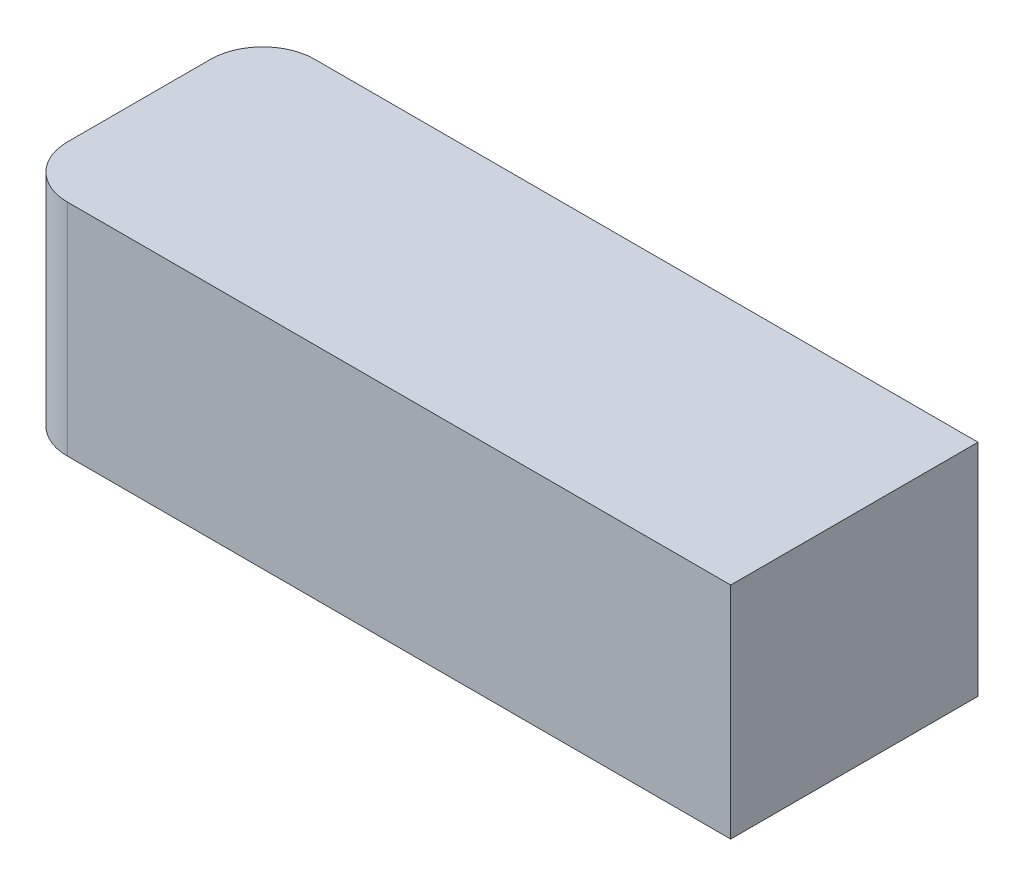
ISO-10303-21;
HEADER;
FILE_DESCRIPTION(('STEP AP214'),'2;1');
FILE_NAME('part.step','',(''),(''),'','','');
FILE_SCHEMA(('AUTOMOTIVE_DESIGN { 1 0 10303 214 1 1 1 1 }'));
ENDSEC;
DATA;
#1=APPLICATION_CONTEXT('core data for automotive mechanical design processes');
#2=APPLICATION_PROTOCOL_DEFINITION('international standard','automotive_design',2000,#1);
#3=PRODUCT_CONTEXT('',#1,'mechanical');
#4=PRODUCT('Part','Part','',(#3));
#5=PRODUCT_RELATED_PRODUCT_CATEGORY('part','',(#4));
#6=PRODUCT_DEFINITION_FORMATION('','',#4);
#7=PRODUCT_DEFINITION_CONTEXT('part definition',#1,'design');
#8=PRODUCT_DEFINITION('design','',#6,#7);
#9=PRODUCT_DEFINITION_SHAPE('','',#8);
#10=(LENGTH_UNIT() NAMED_UNIT(*) SI_UNIT(.MILLI.,.METRE.));
#11=(NAMED_UNIT(*) PLANE_ANGLE_UNIT() SI_UNIT($,.RADIAN.));
#12=(NAMED_UNIT(*) SI_UNIT($,.STERADIAN.) SOLID_ANGLE_UNIT());
#13=UNCERTAINTY_MEASURE_WITH_UNIT(LENGTH_MEASURE(1.E-05),#10,'distance_accuracy_value','');
#14=(GEOMETRIC_REPRESENTATION_CONTEXT(3) GLOBAL_UNCERTAINTY_ASSIGNED_CONTEXT((#13)) GLOBAL_UNIT_ASSIGNED_CONTEXT((#10,
#11,#12)) REPRESENTATION_CONTEXT('',''));
#15=CARTESIAN_POINT('',(0.,0.,0.));
#16=DIRECTION('',(0.,0.,1.));
#17=DIRECTION('',(1.,0.,0.));
#18=AXIS2_PLACEMENT_3D('',#15,#16,#17);
#19=CARTESIAN_POINT('',(0.,42.23,47.46));
#20=DIRECTION('',(1.,0.,0.));
#21=DIRECTION('',(0.,0.,-1.));
#22=AXIS2_PLACEMENT_3D('',#19,#20,#21);
#23=PLANE('',#22);
#24=DIRECTION('',(0.,0.,-1.));
#25=VECTOR('',#24,1.);
#26=CARTESIAN_POINT('',(0.,0.,47.46));
#27=LINE('',#26,#25);
#28=CARTESIAN_POINT('',(0.,0.,37.46));
#29=VERTEX_POINT('',#28);
#30=CARTESIAN_POINT('',(0.,0.,10.));
#31=VERTEX_POINT('',#30);
#32=EDGE_CURVE('E103',#29,#31,#27,.T.);
#33=ORIENTED_EDGE('',*,*,#32,.F.);
#34=DIRECTION('',(0.,-1.,0.));
#35=VECTOR('',#34,1.);
#36=CARTESIAN_POINT('',(0.,42.23,37.46));
#37=LINE('',#36,#35);
#38=CARTESIAN_POINT('',(0.,42.23,37.46));
#39=VERTEX_POINT('',#38);
#40=EDGE_CURVE('E130',#29,#39,#37,.F.);
#41=ORIENTED_EDGE('',*,*,#40,.T.);
#42=DIRECTION('',(0.,0.,-1.));
#43=VECTOR('',#42,1.);
#44=CARTESIAN_POINT('',(0.,42.23,47.46));
#45=LINE('',#44,#43);
#46=CARTESIAN_POINT('',(0.,42.23,10.));
#47=VERTEX_POINT('',#46);
#48=EDGE_CURVE('E111',#39,#47,#45,.T.);
#49=ORIENTED_EDGE('',*,*,#48,.T.);
#50=DIRECTION('',(0.,-1.,0.));
#51=VECTOR('',#50,1.);
#52=CARTESIAN_POINT('',(0.,42.23,10.));
#53=LINE('',#52,#51);
#54=EDGE_CURVE('E127',#47,#31,#53,.T.);
#55=ORIENTED_EDGE('',*,*,#54,.T.);
#56=EDGE_LOOP('',(#33,#41,#49,#55));
#57=FACE_BOUND('',#56,.T.);
#58=ADVANCED_FACE('F31',(#57),#23,.F.);
#59=CARTESIAN_POINT('',(0.,0.,47.46));
#60=DIRECTION('',(0.,1.,0.));
#61=DIRECTION('',(0.,0.,1.));
#62=AXIS2_PLACEMENT_3D('',#59,#60,#61);
#63=PLANE('',#62);
#64=DIRECTION('',(1.,0.,0.));
#65=VECTOR('',#64,1.);
#66=CARTESIAN_POINT('',(0.,0.,47.46));
#67=LINE('',#66,#65);
#68=CARTESIAN_POINT('',(10.,0.,47.46));
#69=VERTEX_POINT('',#68);
#70=CARTESIAN_POINT('',(137.28,0.,47.46));
#71=VERTEX_POINT('',#70);
#72=EDGE_CURVE('E85',#69,#71,#67,.T.);
#73=ORIENTED_EDGE('',*,*,#72,.F.);
#74=CARTESIAN_POINT('',(10.,0.,37.46));
#75=DIRECTION('',(0.,1.,0.));
#76=DIRECTION('',(0.,0.,1.));
#77=AXIS2_PLACEMENT_3D('',#74,#75,#76);
#78=CIRCLE('',#77,10.);
#79=EDGE_CURVE('E125',#69,#29,#78,.F.);
#80=ORIENTED_EDGE('',*,*,#79,.T.);
#81=ORIENTED_EDGE('',*,*,#32,.T.);
#82=CARTESIAN_POINT('',(10.,0.,10.));
#83=DIRECTION('',(0.,1.,0.));
#84=DIRECTION('',(0.,0.,1.));
#85=AXIS2_PLACEMENT_3D('',#82,#83,#84);
#86=CIRCLE('',#85,10.);
#87=CARTESIAN_POINT('',(10.,0.,0.));
#88=VERTEX_POINT('',#87);
#89=EDGE_CURVE('E123',#31,#88,#86,.F.);
#90=ORIENTED_EDGE('',*,*,#89,.T.);
#91=DIRECTION('',(1.,0.,0.));
#92=VECTOR('',#91,1.);
#93=CARTESIAN_POINT('',(0.,0.,0.));
#94=LINE('',#93,#92);
#95=CARTESIAN_POINT('',(137.28,0.,0.));
#96=VERTEX_POINT('',#95);
#97=EDGE_CURVE('E100',#88,#96,#94,.T.);
#98=ORIENTED_EDGE('',*,*,#97,.T.);
#99=DIRECTION('',(0.,0.,-1.));
#100=VECTOR('',#99,1.);
#101=CARTESIAN_POINT('',(137.28,0.,47.46));
#102=LINE('',#101,#100);
#103=EDGE_CURVE('E98',#71,#96,#102,.T.);
#104=ORIENTED_EDGE('',*,*,#103,.F.);
#105=EDGE_LOOP('',(#73,#80,#81,#90,#98,#104));
#106=FACE_BOUND('',#105,.T.);
#107=ADVANCED_FACE('F99',(#106),#63,.F.);
#108=CARTESIAN_POINT('',(137.28,0.,47.46));
#109=DIRECTION('',(-1.,0.,0.));
#110=DIRECTION('',(0.,0.,1.));
#111=AXIS2_PLACEMENT_3D('',#108,#109,#110);
#112=PLANE('',#111);
#113=DIRECTION('',(0.,1.,0.));
#114=VECTOR('',#113,1.);
#115=CARTESIAN_POINT('',(137.28,0.,0.));
#116=LINE('',#115,#114);
#117=CARTESIAN_POINT('',(137.28,42.23,0.));
#118=VERTEX_POINT('',#117);
#119=EDGE_CURVE('E115',#96,#118,#116,.T.);
#120=ORIENTED_EDGE('',*,*,#119,.T.);
#121=DIRECTION('',(0.,0.,-1.));
#122=VECTOR('',#121,1.);
#123=CARTESIAN_POINT('',(137.28,42.23,47.46));
#124=LINE('',#123,#122);
#125=CARTESIAN_POINT('',(137.28,42.23,47.46));
#126=VERTEX_POINT('',#125);
#127=EDGE_CURVE('E104',#126,#118,#124,.T.);
#128=ORIENTED_EDGE('',*,*,#127,.F.);
#129=DIRECTION('',(0.,1.,0.));
#130=VECTOR('',#129,1.);
#131=CARTESIAN_POINT('',(137.28,0.,47.46));
#132=LINE('',#131,#130);
#133=EDGE_CURVE('E90',#71,#126,#132,.T.);
#134=ORIENTED_EDGE('',*,*,#133,.F.);
#135=ORIENTED_EDGE('',*,*,#103,.T.);
#136=EDGE_LOOP('',(#120,#128,#134,#135));
#137=FACE_BOUND('',#136,.T.);
#138=ADVANCED_FACE('F106',(#137),#112,.F.);
#139=CARTESIAN_POINT('',(137.28,42.23,47.46));
#140=DIRECTION('',(0.,-1.,0.));
#141=DIRECTION('',(0.,0.,-1.));
#142=AXIS2_PLACEMENT_3D('',#139,#140,#141);
#143=PLANE('',#142);
#144=ORIENTED_EDGE('',*,*,#48,.F.);
#145=CARTESIAN_POINT('',(10.,42.23,37.46));
#146=DIRECTION('',(0.,-1.,0.));
#147=DIRECTION('',(0.,0.,-1.));
#148=AXIS2_PLACEMENT_3D('',#145,#146,#147);
#149=CIRCLE('',#148,10.);
#150=CARTESIAN_POINT('',(10.,42.23,47.46));
#151=VERTEX_POINT('',#150);
#152=EDGE_CURVE('E39',#39,#151,#149,.F.);
#153=ORIENTED_EDGE('',*,*,#152,.T.);
#154=DIRECTION('',(-1.,0.,0.));
#155=VECTOR('',#154,1.);
#156=CARTESIAN_POINT('',(137.28,42.23,47.46));
#157=LINE('',#156,#155);
#158=EDGE_CURVE('E109',#126,#151,#157,.T.);
#159=ORIENTED_EDGE('',*,*,#158,.F.);
#160=ORIENTED_EDGE('',*,*,#127,.T.);
#161=DIRECTION('',(-1.,0.,0.));
#162=VECTOR('',#161,1.);
#163=CARTESIAN_POINT('',(137.28,42.23,0.));
#164=LINE('',#163,#162);
#165=CARTESIAN_POINT('',(10.,42.23,0.));
#166=VERTEX_POINT('',#165);
#167=EDGE_CURVE('E95',#118,#166,#164,.T.);
#168=ORIENTED_EDGE('',*,*,#167,.T.);
#169=CARTESIAN_POINT('',(10.,42.23,10.));
#170=DIRECTION('',(0.,-1.,0.));
#171=DIRECTION('',(0.,0.,-1.));
#172=AXIS2_PLACEMENT_3D('',#169,#170,#171);
#173=CIRCLE('',#172,10.);
#174=EDGE_CURVE('E51',#166,#47,#173,.F.);
#175=ORIENTED_EDGE('',*,*,#174,.T.);
#176=EDGE_LOOP('',(#144,#153,#159,#160,#168,#175));
#177=FACE_BOUND('',#176,.T.);
#178=ADVANCED_FACE('F133',(#177),#143,.F.);
#179=CARTESIAN_POINT('',(0.,0.,47.46));
#180=DIRECTION('',(0.,0.,1.));
#181=DIRECTION('',(1.,0.,0.));
#182=AXIS2_PLACEMENT_3D('',#179,#180,#181);
#183=PLANE('',#182);
#184=ORIENTED_EDGE('',*,*,#158,.T.);
#185=DIRECTION('',(0.,-1.,0.));
#186=VECTOR('',#185,1.);
#187=CARTESIAN_POINT('',(10.,0.,47.46));
#188=LINE('',#187,#186);
#189=EDGE_CURVE('E93',#151,#69,#188,.T.);
#190=ORIENTED_EDGE('',*,*,#189,.T.);
#191=ORIENTED_EDGE('',*,*,#72,.T.);
#192=ORIENTED_EDGE('',*,*,#133,.T.);
#193=EDGE_LOOP('',(#184,#190,#191,#192));
#194=FACE_BOUND('',#193,.T.);
#195=ADVANCED_FACE('F88',(#194),#183,.T.);
#196=CARTESIAN_POINT('',(0.,0.,0.));
#197=DIRECTION('',(0.,0.,1.));
#198=DIRECTION('',(1.,0.,0.));
#199=AXIS2_PLACEMENT_3D('',#196,#197,#198);
#200=PLANE('',#199);
#201=ORIENTED_EDGE('',*,*,#97,.F.);
#202=DIRECTION('',(0.,-1.,0.));
#203=VECTOR('',#202,1.);
#204=CARTESIAN_POINT('',(10.,0.,0.));
#205=LINE('',#204,#203);
#206=EDGE_CURVE('E11',#88,#166,#205,.F.);
#207=ORIENTED_EDGE('',*,*,#206,.T.);
#208=ORIENTED_EDGE('',*,*,#167,.F.);
#209=ORIENTED_EDGE('',*,*,#119,.F.);
#210=EDGE_LOOP('',(#201,#207,#208,#209));
#211=FACE_BOUND('',#210,.T.);
#212=ADVANCED_FACE('F141',(#211),#200,.F.);
#213=CARTESIAN_POINT('',(10.,0.,37.46));
#214=DIRECTION('',(0.,1.,0.));
#215=DIRECTION('',(0.,0.,1.));
#216=AXIS2_PLACEMENT_3D('',#213,#214,#215);
#217=CYLINDRICAL_SURFACE('',#216,10.);
#218=ORIENTED_EDGE('',*,*,#152,.F.);
#219=ORIENTED_EDGE('',*,*,#40,.F.);
#220=ORIENTED_EDGE('',*,*,#79,.F.);
#221=ORIENTED_EDGE('',*,*,#189,.F.);
#222=EDGE_LOOP('',(#218,#219,#220,#221));
#223=FACE_BOUND('',#222,.T.);
#224=ADVANCED_FACE('F136',(#223),#217,.T.);
#225=CARTESIAN_POINT('',(10.,42.23,10.));
#226=DIRECTION('',(0.,-1.,0.));
#227=DIRECTION('',(0.,0.,-1.));
#228=AXIS2_PLACEMENT_3D('',#225,#226,#227);
#229=CYLINDRICAL_SURFACE('',#228,10.);
#230=ORIENTED_EDGE('',*,*,#174,.F.);
#231=ORIENTED_EDGE('',*,*,#206,.F.);
#232=ORIENTED_EDGE('',*,*,#89,.F.);
#233=ORIENTED_EDGE('',*,*,#54,.F.);
#234=EDGE_LOOP('',(#230,#231,#232,#233));
#235=FACE_BOUND('',#234,.T.);
#236=ADVANCED_FACE('F33',(#235),#229,.T.);
#237=CLOSED_SHELL('',(#58,#107,#138,#178,#195,#212,#224,#236));
#238=MANIFOLD_SOLID_BREP('B2',#237);
#239=ADVANCED_BREP_SHAPE_REPRESENTATION('',(#18,#238),#14);
#240=SHAPE_DEFINITION_REPRESENTATION(#9,#239);
ENDSEC;
END-ISO-10303-21;
